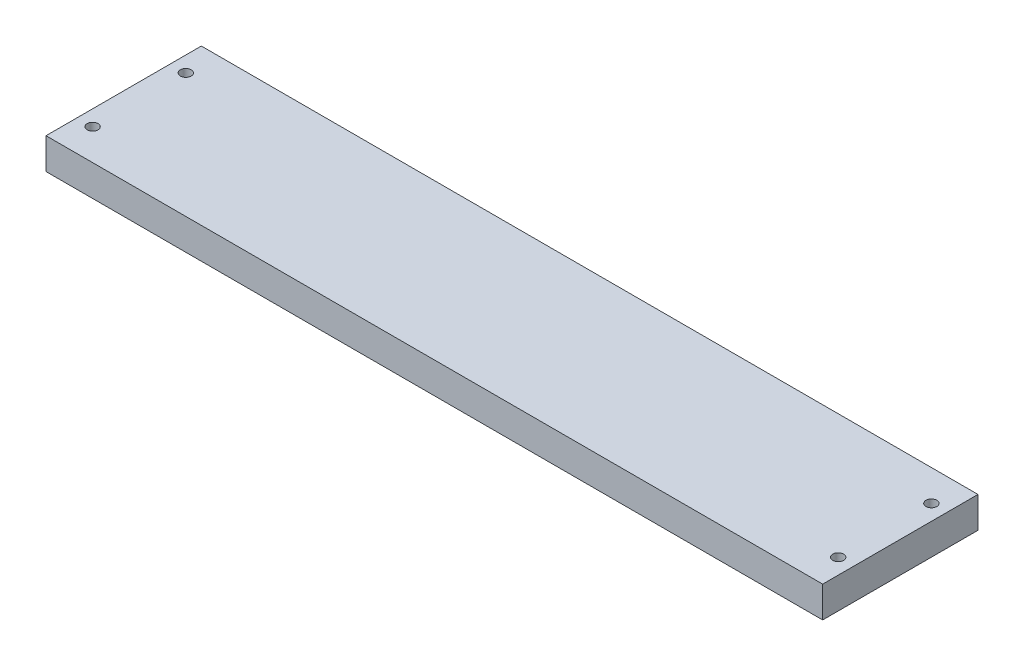
ISO-10303-21;
HEADER;
FILE_DESCRIPTION(('STEP AP214'),'2;1');
FILE_NAME('part.step','',(''),(''),'','','');
FILE_SCHEMA(('AUTOMOTIVE_DESIGN { 1 0 10303 214 1 1 1 1 }'));
ENDSEC;
DATA;
#1=APPLICATION_CONTEXT('core data for automotive mechanical design processes');
#2=APPLICATION_PROTOCOL_DEFINITION('international standard','automotive_design',2000,#1);
#3=PRODUCT_CONTEXT('',#1,'mechanical');
#4=PRODUCT('Part','Part','',(#3));
#5=PRODUCT_RELATED_PRODUCT_CATEGORY('part','',(#4));
#6=PRODUCT_DEFINITION_FORMATION('','',#4);
#7=PRODUCT_DEFINITION_CONTEXT('part definition',#1,'design');
#8=PRODUCT_DEFINITION('design','',#6,#7);
#9=PRODUCT_DEFINITION_SHAPE('','',#8);
#10=(LENGTH_UNIT() NAMED_UNIT(*) SI_UNIT(.MILLI.,.METRE.));
#11=(NAMED_UNIT(*) PLANE_ANGLE_UNIT() SI_UNIT($,.RADIAN.));
#12=(NAMED_UNIT(*) SI_UNIT($,.STERADIAN.) SOLID_ANGLE_UNIT());
#13=UNCERTAINTY_MEASURE_WITH_UNIT(LENGTH_MEASURE(1.E-05),#10,'distance_accuracy_value','');
#14=(GEOMETRIC_REPRESENTATION_CONTEXT(3) GLOBAL_UNCERTAINTY_ASSIGNED_CONTEXT((#13)) GLOBAL_UNIT_ASSIGNED_CONTEXT((#10,
#11,#12)) REPRESENTATION_CONTEXT('',''));
#15=CARTESIAN_POINT('',(0.,0.,0.));
#16=DIRECTION('',(0.,0.,1.));
#17=DIRECTION('',(1.,0.,0.));
#18=AXIS2_PLACEMENT_3D('',#15,#16,#17);
#19=CARTESIAN_POINT('',(0.,10.,-50.));
#20=DIRECTION('',(0.,-1.,0.));
#21=DIRECTION('',(0.,0.,-1.));
#22=AXIS2_PLACEMENT_3D('',#19,#20,#21);
#23=PLANE('',#22);
#24=CARTESIAN_POINT('',(245.,10.,-10.));
#25=DIRECTION('',(0.,1.,0.));
#26=DIRECTION('',(0.,0.,1.));
#27=AXIS2_PLACEMENT_3D('',#24,#25,#26);
#28=CIRCLE('',#27,1.75000000000001);
#29=CARTESIAN_POINT('',(245.,10.,-8.24999999999999));
#30=VERTEX_POINT('',#29);
#31=EDGE_CURVE('E119',#30,#30,#28,.T.);
#32=ORIENTED_EDGE('',*,*,#31,.F.);
#33=EDGE_LOOP('',(#32));
#34=FACE_BOUND('',#33,.T.);
#35=CARTESIAN_POINT('',(5.,10.,-40.));
#36=DIRECTION('',(0.,1.,0.));
#37=DIRECTION('',(0.,0.,1.));
#38=AXIS2_PLACEMENT_3D('',#35,#36,#37);
#39=CIRCLE('',#38,1.75);
#40=CARTESIAN_POINT('',(5.,10.,-38.25));
#41=VERTEX_POINT('',#40);
#42=EDGE_CURVE('E98',#41,#41,#39,.T.);
#43=ORIENTED_EDGE('',*,*,#42,.F.);
#44=EDGE_LOOP('',(#43));
#45=FACE_BOUND('',#44,.T.);
#46=DIRECTION('',(0.,0.,1.));
#47=VECTOR('',#46,1.);
#48=CARTESIAN_POINT('',(0.,10.,0.));
#49=LINE('',#48,#47);
#50=CARTESIAN_POINT('',(0.,10.,-50.));
#51=VERTEX_POINT('',#50);
#52=CARTESIAN_POINT('',(0.,10.,0.));
#53=VERTEX_POINT('',#52);
#54=EDGE_CURVE('E83',#51,#53,#49,.T.);
#55=ORIENTED_EDGE('',*,*,#54,.T.);
#56=DIRECTION('',(1.,0.,0.));
#57=VECTOR('',#56,1.);
#58=CARTESIAN_POINT('',(0.,10.,0.));
#59=LINE('',#58,#57);
#60=CARTESIAN_POINT('',(250.,10.,0.));
#61=VERTEX_POINT('',#60);
#62=EDGE_CURVE('E78',#53,#61,#59,.T.);
#63=ORIENTED_EDGE('',*,*,#62,.T.);
#64=DIRECTION('',(0.,0.,-1.));
#65=VECTOR('',#64,1.);
#66=CARTESIAN_POINT('',(250.,10.,0.));
#67=LINE('',#66,#65);
#68=CARTESIAN_POINT('',(250.,10.,-50.));
#69=VERTEX_POINT('',#68);
#70=EDGE_CURVE('E81',#61,#69,#67,.T.);
#71=ORIENTED_EDGE('',*,*,#70,.T.);
#72=DIRECTION('',(-1.,0.,0.));
#73=VECTOR('',#72,1.);
#74=CARTESIAN_POINT('',(0.,10.,-50.));
#75=LINE('',#74,#73);
#76=EDGE_CURVE('E48',#69,#51,#75,.T.);
#77=ORIENTED_EDGE('',*,*,#76,.T.);
#78=EDGE_LOOP('',(#55,#63,#71,#77));
#79=FACE_BOUND('',#78,.T.);
#80=CARTESIAN_POINT('',(5.,10.,-10.));
#81=DIRECTION('',(0.,1.,0.));
#82=DIRECTION('',(0.,0.,1.));
#83=AXIS2_PLACEMENT_3D('',#80,#81,#82);
#84=CIRCLE('',#83,1.75);
#85=CARTESIAN_POINT('',(5.,10.,-8.25));
#86=VERTEX_POINT('',#85);
#87=EDGE_CURVE('E113',#86,#86,#84,.T.);
#88=ORIENTED_EDGE('',*,*,#87,.F.);
#89=EDGE_LOOP('',(#88));
#90=FACE_BOUND('',#89,.T.);
#91=CARTESIAN_POINT('',(245.,10.,-40.));
#92=DIRECTION('',(0.,1.,0.));
#93=DIRECTION('',(0.,0.,1.));
#94=AXIS2_PLACEMENT_3D('',#91,#92,#93);
#95=CIRCLE('',#94,1.75000000000001);
#96=CARTESIAN_POINT('',(245.,10.,-38.25));
#97=VERTEX_POINT('',#96);
#98=EDGE_CURVE('E125',#97,#97,#95,.T.);
#99=ORIENTED_EDGE('',*,*,#98,.F.);
#100=EDGE_LOOP('',(#99));
#101=FACE_BOUND('',#100,.T.);
#102=ADVANCED_FACE('F31',(#34,#45,#79,#90,#101),#23,.F.);
#103=CARTESIAN_POINT('',(0.,0.,-50.));
#104=DIRECTION('',(0.,-1.,0.));
#105=DIRECTION('',(0.,0.,-1.));
#106=AXIS2_PLACEMENT_3D('',#103,#104,#105);
#107=PLANE('',#106);
#108=CARTESIAN_POINT('',(245.,0.,-10.));
#109=DIRECTION('',(0.,1.,0.));
#110=DIRECTION('',(0.,0.,1.));
#111=AXIS2_PLACEMENT_3D('',#108,#109,#110);
#112=CIRCLE('',#111,1.75000000000001);
#113=CARTESIAN_POINT('',(245.,0.,-8.24999999999999));
#114=VERTEX_POINT('',#113);
#115=EDGE_CURVE('E122',#114,#114,#112,.T.);
#116=ORIENTED_EDGE('',*,*,#115,.T.);
#117=EDGE_LOOP('',(#116));
#118=FACE_BOUND('',#117,.T.);
#119=CARTESIAN_POINT('',(5.,0.,-40.));
#120=DIRECTION('',(0.,1.,0.));
#121=DIRECTION('',(0.,0.,1.));
#122=AXIS2_PLACEMENT_3D('',#119,#120,#121);
#123=CIRCLE('',#122,1.75);
#124=CARTESIAN_POINT('',(5.,0.,-38.25));
#125=VERTEX_POINT('',#124);
#126=EDGE_CURVE('E110',#125,#125,#123,.T.);
#127=ORIENTED_EDGE('',*,*,#126,.T.);
#128=EDGE_LOOP('',(#127));
#129=FACE_BOUND('',#128,.T.);
#130=DIRECTION('',(0.,0.,1.));
#131=VECTOR('',#130,1.);
#132=CARTESIAN_POINT('',(0.,0.,0.));
#133=LINE('',#132,#131);
#134=CARTESIAN_POINT('',(0.,0.,-50.));
#135=VERTEX_POINT('',#134);
#136=CARTESIAN_POINT('',(0.,0.,0.));
#137=VERTEX_POINT('',#136);
#138=EDGE_CURVE('E95',#135,#137,#133,.T.);
#139=ORIENTED_EDGE('',*,*,#138,.F.);
#140=DIRECTION('',(-1.,0.,0.));
#141=VECTOR('',#140,1.);
#142=CARTESIAN_POINT('',(0.,0.,-50.));
#143=LINE('',#142,#141);
#144=CARTESIAN_POINT('',(250.,0.,-50.));
#145=VERTEX_POINT('',#144);
#146=EDGE_CURVE('E71',#145,#135,#143,.T.);
#147=ORIENTED_EDGE('',*,*,#146,.F.);
#148=DIRECTION('',(0.,0.,-1.));
#149=VECTOR('',#148,1.);
#150=CARTESIAN_POINT('',(250.,0.,0.));
#151=LINE('',#150,#149);
#152=CARTESIAN_POINT('',(250.,0.,0.));
#153=VERTEX_POINT('',#152);
#154=EDGE_CURVE('E65',#153,#145,#151,.T.);
#155=ORIENTED_EDGE('',*,*,#154,.F.);
#156=DIRECTION('',(1.,0.,0.));
#157=VECTOR('',#156,1.);
#158=CARTESIAN_POINT('',(0.,0.,0.));
#159=LINE('',#158,#157);
#160=EDGE_CURVE('E87',#137,#153,#159,.T.);
#161=ORIENTED_EDGE('',*,*,#160,.F.);
#162=EDGE_LOOP('',(#139,#147,#155,#161));
#163=FACE_BOUND('',#162,.T.);
#164=CARTESIAN_POINT('',(5.,0.,-10.));
#165=DIRECTION('',(0.,1.,0.));
#166=DIRECTION('',(0.,0.,1.));
#167=AXIS2_PLACEMENT_3D('',#164,#165,#166);
#168=CIRCLE('',#167,1.75);
#169=CARTESIAN_POINT('',(5.,0.,-8.25));
#170=VERTEX_POINT('',#169);
#171=EDGE_CURVE('E116',#170,#170,#168,.T.);
#172=ORIENTED_EDGE('',*,*,#171,.T.);
#173=EDGE_LOOP('',(#172));
#174=FACE_BOUND('',#173,.T.);
#175=CARTESIAN_POINT('',(245.,0.,-40.));
#176=DIRECTION('',(0.,1.,0.));
#177=DIRECTION('',(0.,0.,1.));
#178=AXIS2_PLACEMENT_3D('',#175,#176,#177);
#179=CIRCLE('',#178,1.75000000000001);
#180=CARTESIAN_POINT('',(245.,0.,-38.25));
#181=VERTEX_POINT('',#180);
#182=EDGE_CURVE('E128',#181,#181,#179,.T.);
#183=ORIENTED_EDGE('',*,*,#182,.T.);
#184=EDGE_LOOP('',(#183));
#185=FACE_BOUND('',#184,.T.);
#186=ADVANCED_FACE('F106',(#118,#129,#163,#174,#185),#107,.T.);
#187=CARTESIAN_POINT('',(0.,10.,0.));
#188=DIRECTION('',(1.,0.,0.));
#189=DIRECTION('',(0.,0.,-1.));
#190=AXIS2_PLACEMENT_3D('',#187,#188,#189);
#191=PLANE('',#190);
#192=ORIENTED_EDGE('',*,*,#138,.T.);
#193=DIRECTION('',(0.,-1.,0.));
#194=VECTOR('',#193,1.);
#195=CARTESIAN_POINT('',(0.,10.,0.));
#196=LINE('',#195,#194);
#197=EDGE_CURVE('E11',#53,#137,#196,.T.);
#198=ORIENTED_EDGE('',*,*,#197,.F.);
#199=ORIENTED_EDGE('',*,*,#54,.F.);
#200=DIRECTION('',(0.,-1.,0.));
#201=VECTOR('',#200,1.);
#202=CARTESIAN_POINT('',(0.,10.,-50.));
#203=LINE('',#202,#201);
#204=EDGE_CURVE('E91',#51,#135,#203,.T.);
#205=ORIENTED_EDGE('',*,*,#204,.T.);
#206=EDGE_LOOP('',(#192,#198,#199,#205));
#207=FACE_BOUND('',#206,.T.);
#208=ADVANCED_FACE('F33',(#207),#191,.F.);
#209=CARTESIAN_POINT('',(0.,10.,0.));
#210=DIRECTION('',(0.,0.,-1.));
#211=DIRECTION('',(-1.,0.,0.));
#212=AXIS2_PLACEMENT_3D('',#209,#210,#211);
#213=PLANE('',#212);
#214=ORIENTED_EDGE('',*,*,#160,.T.);
#215=DIRECTION('',(0.,-1.,0.));
#216=VECTOR('',#215,1.);
#217=CARTESIAN_POINT('',(250.,10.,0.));
#218=LINE('',#217,#216);
#219=EDGE_CURVE('E40',#61,#153,#218,.T.);
#220=ORIENTED_EDGE('',*,*,#219,.F.);
#221=ORIENTED_EDGE('',*,*,#62,.F.);
#222=ORIENTED_EDGE('',*,*,#197,.T.);
#223=EDGE_LOOP('',(#214,#220,#221,#222));
#224=FACE_BOUND('',#223,.T.);
#225=ADVANCED_FACE('F86',(#224),#213,.F.);
#226=CARTESIAN_POINT('',(250.,10.,0.));
#227=DIRECTION('',(-1.,0.,0.));
#228=DIRECTION('',(0.,0.,1.));
#229=AXIS2_PLACEMENT_3D('',#226,#227,#228);
#230=PLANE('',#229);
#231=ORIENTED_EDGE('',*,*,#154,.T.);
#232=DIRECTION('',(0.,-1.,0.));
#233=VECTOR('',#232,1.);
#234=CARTESIAN_POINT('',(250.,10.,-50.));
#235=LINE('',#234,#233);
#236=EDGE_CURVE('E88',#69,#145,#235,.T.);
#237=ORIENTED_EDGE('',*,*,#236,.F.);
#238=ORIENTED_EDGE('',*,*,#70,.F.);
#239=ORIENTED_EDGE('',*,*,#219,.T.);
#240=EDGE_LOOP('',(#231,#237,#238,#239));
#241=FACE_BOUND('',#240,.T.);
#242=ADVANCED_FACE('F89',(#241),#230,.F.);
#243=CARTESIAN_POINT('',(0.,10.,-50.));
#244=DIRECTION('',(0.,0.,1.));
#245=DIRECTION('',(1.,0.,0.));
#246=AXIS2_PLACEMENT_3D('',#243,#244,#245);
#247=PLANE('',#246);
#248=ORIENTED_EDGE('',*,*,#146,.T.);
#249=ORIENTED_EDGE('',*,*,#204,.F.);
#250=ORIENTED_EDGE('',*,*,#76,.F.);
#251=ORIENTED_EDGE('',*,*,#236,.T.);
#252=EDGE_LOOP('',(#248,#249,#250,#251));
#253=FACE_BOUND('',#252,.T.);
#254=ADVANCED_FACE('F103',(#253),#247,.F.);
#255=CARTESIAN_POINT('',(5.,10.,-40.));
#256=DIRECTION('',(0.,-1.,0.));
#257=DIRECTION('',(0.,0.,-1.));
#258=AXIS2_PLACEMENT_3D('',#255,#256,#257);
#259=CYLINDRICAL_SURFACE('',#258,1.75);
#260=ORIENTED_EDGE('',*,*,#42,.T.);
#261=EDGE_LOOP('',(#260));
#262=FACE_BOUND('',#261,.T.);
#263=ORIENTED_EDGE('',*,*,#126,.F.);
#264=EDGE_LOOP('',(#263));
#265=FACE_BOUND('',#264,.T.);
#266=ADVANCED_FACE('F148',(#262,#265),#259,.F.);
#267=CARTESIAN_POINT('',(5.,10.,-10.));
#268=DIRECTION('',(0.,-1.,0.));
#269=DIRECTION('',(0.,0.,-1.));
#270=AXIS2_PLACEMENT_3D('',#267,#268,#269);
#271=CYLINDRICAL_SURFACE('',#270,1.75);
#272=ORIENTED_EDGE('',*,*,#87,.T.);
#273=EDGE_LOOP('',(#272));
#274=FACE_BOUND('',#273,.T.);
#275=ORIENTED_EDGE('',*,*,#171,.F.);
#276=EDGE_LOOP('',(#275));
#277=FACE_BOUND('',#276,.T.);
#278=ADVANCED_FACE('F194',(#274,#277),#271,.F.);
#279=CARTESIAN_POINT('',(245.,10.,-10.));
#280=DIRECTION('',(0.,-1.,0.));
#281=DIRECTION('',(0.,0.,-1.));
#282=AXIS2_PLACEMENT_3D('',#279,#280,#281);
#283=CYLINDRICAL_SURFACE('',#282,1.75000000000001);
#284=ORIENTED_EDGE('',*,*,#31,.T.);
#285=EDGE_LOOP('',(#284));
#286=FACE_BOUND('',#285,.T.);
#287=ORIENTED_EDGE('',*,*,#115,.F.);
#288=EDGE_LOOP('',(#287));
#289=FACE_BOUND('',#288,.T.);
#290=ADVANCED_FACE('F202',(#286,#289),#283,.F.);
#291=CARTESIAN_POINT('',(245.,10.,-40.));
#292=DIRECTION('',(0.,-1.,0.));
#293=DIRECTION('',(0.,0.,-1.));
#294=AXIS2_PLACEMENT_3D('',#291,#292,#293);
#295=CYLINDRICAL_SURFACE('',#294,1.75000000000001);
#296=ORIENTED_EDGE('',*,*,#98,.T.);
#297=EDGE_LOOP('',(#296));
#298=FACE_BOUND('',#297,.T.);
#299=ORIENTED_EDGE('',*,*,#182,.F.);
#300=EDGE_LOOP('',(#299));
#301=FACE_BOUND('',#300,.T.);
#302=ADVANCED_FACE('F134',(#298,#301),#295,.F.);
#303=CLOSED_SHELL('',(#102,#186,#208,#225,#242,#254,#266,#278,#290,#302));
#304=MANIFOLD_SOLID_BREP('B2',#303);
#305=ADVANCED_BREP_SHAPE_REPRESENTATION('',(#18,#304),#14);
#306=SHAPE_DEFINITION_REPRESENTATION(#9,#305);
ENDSEC;
END-ISO-10303-21;
